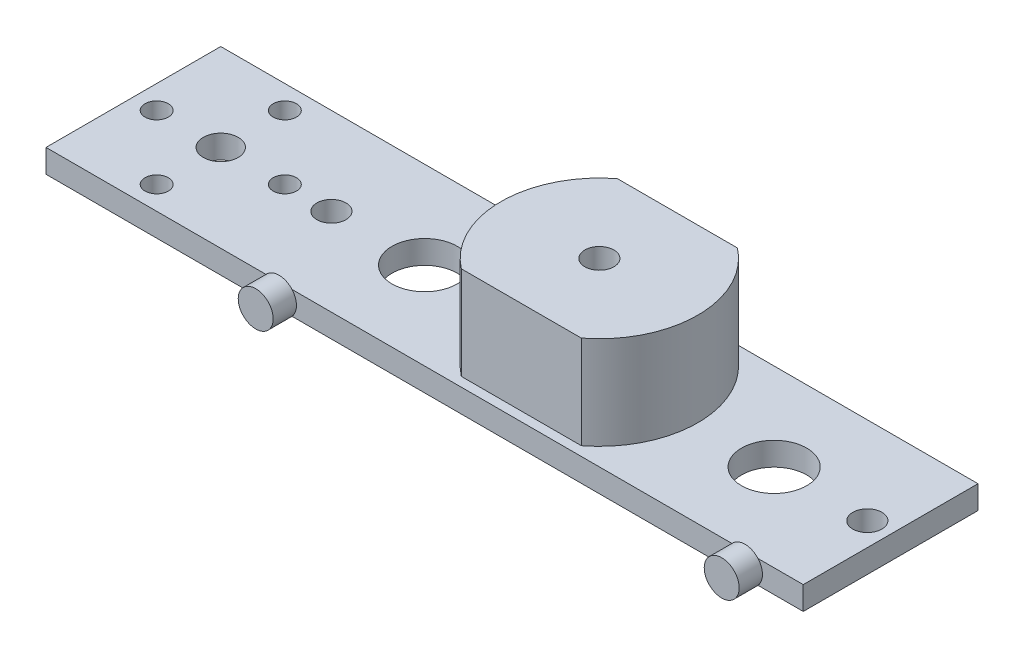
ISO-10303-21;
HEADER;
FILE_DESCRIPTION(('STEP AP214'),'2;1');
FILE_NAME('part.step','',(''),(''),'','','');
FILE_SCHEMA(('AUTOMOTIVE_DESIGN { 1 0 10303 214 1 1 1 1 }'));
ENDSEC;
DATA;
#1=APPLICATION_CONTEXT('core data for automotive mechanical design processes');
#2=APPLICATION_PROTOCOL_DEFINITION('international standard','automotive_design',2000,#1);
#3=PRODUCT_CONTEXT('',#1,'mechanical');
#4=PRODUCT('Part','Part','',(#3));
#5=PRODUCT_RELATED_PRODUCT_CATEGORY('part','',(#4));
#6=PRODUCT_DEFINITION_FORMATION('','',#4);
#7=PRODUCT_DEFINITION_CONTEXT('part definition',#1,'design');
#8=PRODUCT_DEFINITION('design','',#6,#7);
#9=PRODUCT_DEFINITION_SHAPE('','',#8);
#10=(LENGTH_UNIT() NAMED_UNIT(*) SI_UNIT(.MILLI.,.METRE.));
#11=(NAMED_UNIT(*) PLANE_ANGLE_UNIT() SI_UNIT($,.RADIAN.));
#12=(NAMED_UNIT(*) SI_UNIT($,.STERADIAN.) SOLID_ANGLE_UNIT());
#13=UNCERTAINTY_MEASURE_WITH_UNIT(LENGTH_MEASURE(1.E-05),#10,'distance_accuracy_value','');
#14=(GEOMETRIC_REPRESENTATION_CONTEXT(3) GLOBAL_UNCERTAINTY_ASSIGNED_CONTEXT((#13)) GLOBAL_UNIT_ASSIGNED_CONTEXT((#10,
#11,#12)) REPRESENTATION_CONTEXT('',''));
#15=CARTESIAN_POINT('',(0.,0.,0.));
#16=DIRECTION('',(0.,0.,1.));
#17=DIRECTION('',(1.,0.,0.));
#18=AXIS2_PLACEMENT_3D('',#15,#16,#17);
#19=CARTESIAN_POINT('',(0.,0.,0.));
#20=DIRECTION('',(0.,1.,0.));
#21=DIRECTION('',(0.,0.,1.));
#22=AXIS2_PLACEMENT_3D('',#19,#20,#21);
#23=PLANE('',#22);
#24=CARTESIAN_POINT('',(-23.,0.,0.));
#25=DIRECTION('',(0.,-1.,0.));
#26=DIRECTION('',(0.,0.,-1.));
#27=AXIS2_PLACEMENT_3D('',#24,#25,#26);
#28=CIRCLE('',#27,1.25);
#29=CARTESIAN_POINT('',(-23.,0.,-1.25));
#30=VERTEX_POINT('',#29);
#31=EDGE_CURVE('E362',#30,#30,#28,.T.);
#32=ORIENTED_EDGE('',*,*,#31,.F.);
#33=EDGE_LOOP('',(#32));
#34=FACE_BOUND('',#33,.T.);
#35=CARTESIAN_POINT('',(23.,0.,0.));
#36=DIRECTION('',(0.,1.,0.));
#37=DIRECTION('',(0.,0.,1.));
#38=AXIS2_PLACEMENT_3D('',#35,#36,#37);
#39=CIRCLE('',#38,1.25);
#40=CARTESIAN_POINT('',(23.,0.,1.25));
#41=VERTEX_POINT('',#40);
#42=EDGE_CURVE('E363',#41,#41,#39,.T.);
#43=ORIENTED_EDGE('',*,*,#42,.T.);
#44=EDGE_LOOP('',(#43));
#45=FACE_BOUND('',#44,.T.);
#46=DIRECTION('',(0.,0.,-1.));
#47=VECTOR('',#46,1.);
#48=CARTESIAN_POINT('',(-40.,0.,0.));
#49=LINE('',#48,#47);
#50=CARTESIAN_POINT('',(-40.,0.,7.5));
#51=VERTEX_POINT('',#50);
#52=CARTESIAN_POINT('',(-40.,0.,-7.5));
#53=VERTEX_POINT('',#52);
#54=EDGE_CURVE('E426',#51,#53,#49,.T.);
#55=ORIENTED_EDGE('',*,*,#54,.T.);
#56=DIRECTION('',(-1.,0.,0.));
#57=VECTOR('',#56,1.);
#58=CARTESIAN_POINT('',(0.,0.,-7.5));
#59=LINE('',#58,#57);
#60=CARTESIAN_POINT('',(25.,0.,-7.5));
#61=VERTEX_POINT('',#60);
#62=EDGE_CURVE('E417',#61,#53,#59,.T.);
#63=ORIENTED_EDGE('',*,*,#62,.F.);
#64=DIRECTION('',(0.,0.,1.));
#65=VECTOR('',#64,1.);
#66=CARTESIAN_POINT('',(25.,0.,-7.5));
#67=LINE('',#66,#65);
#68=CARTESIAN_POINT('',(25.,0.,7.5));
#69=VERTEX_POINT('',#68);
#70=EDGE_CURVE('E367',#61,#69,#67,.T.);
#71=ORIENTED_EDGE('',*,*,#70,.T.);
#72=DIRECTION('',(-1.,0.,0.));
#73=VECTOR('',#72,1.);
#74=CARTESIAN_POINT('',(0.,0.,7.5));
#75=LINE('',#74,#73);
#76=CARTESIAN_POINT('',(21.1180339887499,0.,7.5));
#77=VERTEX_POINT('',#76);
#78=EDGE_CURVE('E432',#69,#77,#75,.T.);
#79=ORIENTED_EDGE('',*,*,#78,.T.);
#80=CARTESIAN_POINT('',(18.8819660112501,0.,7.5));
#81=VERTEX_POINT('',#80);
#82=EDGE_CURVE('E436',#77,#81,#75,.T.);
#83=ORIENTED_EDGE('',*,*,#82,.T.);
#84=CARTESIAN_POINT('',(-18.8819660112501,0.,7.5));
#85=VERTEX_POINT('',#84);
#86=EDGE_CURVE('E873',#81,#85,#75,.T.);
#87=ORIENTED_EDGE('',*,*,#86,.T.);
#88=CARTESIAN_POINT('',(-21.1180339887499,0.,7.5));
#89=VERTEX_POINT('',#88);
#90=EDGE_CURVE('E904',#85,#89,#75,.T.);
#91=ORIENTED_EDGE('',*,*,#90,.T.);
#92=EDGE_CURVE('E430',#89,#51,#75,.T.);
#93=ORIENTED_EDGE('',*,*,#92,.T.);
#94=EDGE_LOOP('',(#55,#63,#71,#79,#83,#87,#91,#93));
#95=FACE_BOUND('',#94,.T.);
#96=CARTESIAN_POINT('',(15.,0.,0.));
#97=DIRECTION('',(0.,1.,0.));
#98=DIRECTION('',(0.,0.,1.));
#99=AXIS2_PLACEMENT_3D('',#96,#97,#98);
#100=CIRCLE('',#99,2.80000000000001);
#101=CARTESIAN_POINT('',(15.,0.,2.80000000000001));
#102=VERTEX_POINT('',#101);
#103=EDGE_CURVE('E345',#102,#102,#100,.T.);
#104=ORIENTED_EDGE('',*,*,#103,.T.);
#105=EDGE_LOOP('',(#104));
#106=FACE_BOUND('',#105,.T.);
#107=CARTESIAN_POINT('',(-15.,0.,0.));
#108=DIRECTION('',(0.,-1.,0.));
#109=DIRECTION('',(0.,0.,-1.));
#110=AXIS2_PLACEMENT_3D('',#107,#108,#109);
#111=CIRCLE('',#110,2.8);
#112=CARTESIAN_POINT('',(-15.,0.,-2.8));
#113=VERTEX_POINT('',#112);
#114=EDGE_CURVE('E344',#113,#113,#111,.T.);
#115=ORIENTED_EDGE('',*,*,#114,.F.);
#116=EDGE_LOOP('',(#115));
#117=FACE_BOUND('',#116,.T.);
#118=CARTESIAN_POINT('',(-27.,0.,0.));
#119=DIRECTION('',(0.,1.,0.));
#120=DIRECTION('',(0.,0.,1.));
#121=AXIS2_PLACEMENT_3D('',#118,#119,#120);
#122=CIRCLE('',#121,0.999999999999998);
#123=CARTESIAN_POINT('',(-27.,0.,0.999999999999999));
#124=VERTEX_POINT('',#123);
#125=EDGE_CURVE('E379',#124,#124,#122,.T.);
#126=ORIENTED_EDGE('',*,*,#125,.T.);
#127=EDGE_LOOP('',(#126));
#128=FACE_BOUND('',#127,.T.);
#129=CARTESIAN_POINT('',(-32.5,0.,5.5));
#130=DIRECTION('',(0.,1.,0.));
#131=DIRECTION('',(0.,0.,1.));
#132=AXIS2_PLACEMENT_3D('',#129,#130,#131);
#133=CIRCLE('',#132,0.999999999999998);
#134=CARTESIAN_POINT('',(-32.5,0.,6.5));
#135=VERTEX_POINT('',#134);
#136=EDGE_CURVE('E378',#135,#135,#133,.T.);
#137=ORIENTED_EDGE('',*,*,#136,.T.);
#138=EDGE_LOOP('',(#137));
#139=FACE_BOUND('',#138,.T.);
#140=CARTESIAN_POINT('',(-32.5,0.,0.));
#141=DIRECTION('',(0.,1.,0.));
#142=DIRECTION('',(0.,0.,1.));
#143=AXIS2_PLACEMENT_3D('',#140,#141,#142);
#144=CIRCLE('',#143,1.5);
#145=CARTESIAN_POINT('',(-32.5,0.,1.50000000000001));
#146=VERTEX_POINT('',#145);
#147=EDGE_CURVE('E396',#146,#146,#144,.T.);
#148=ORIENTED_EDGE('',*,*,#147,.T.);
#149=EDGE_LOOP('',(#148));
#150=FACE_BOUND('',#149,.T.);
#151=CARTESIAN_POINT('',(-38.,0.,0.));
#152=DIRECTION('',(0.,1.,0.));
#153=DIRECTION('',(0.,0.,1.));
#154=AXIS2_PLACEMENT_3D('',#151,#152,#153);
#155=CIRCLE('',#154,0.999999999999991);
#156=CARTESIAN_POINT('',(-38.,0.,0.999999999999992));
#157=VERTEX_POINT('',#156);
#158=EDGE_CURVE('E354',#157,#157,#155,.T.);
#159=ORIENTED_EDGE('',*,*,#158,.T.);
#160=EDGE_LOOP('',(#159));
#161=FACE_BOUND('',#160,.T.);
#162=CARTESIAN_POINT('',(-32.5,0.,-5.5));
#163=DIRECTION('',(0.,1.,0.));
#164=DIRECTION('',(0.,0.,1.));
#165=AXIS2_PLACEMENT_3D('',#162,#163,#164);
#166=CIRCLE('',#165,0.999999999999991);
#167=CARTESIAN_POINT('',(-32.5,0.,-4.50000000000001));
#168=VERTEX_POINT('',#167);
#169=EDGE_CURVE('E388',#168,#168,#166,.T.);
#170=ORIENTED_EDGE('',*,*,#169,.T.);
#171=EDGE_LOOP('',(#170));
#172=FACE_BOUND('',#171,.T.);
#173=DIRECTION('',(-1.,0.,0.));
#174=VECTOR('',#173,1.);
#175=CARTESIAN_POINT('',(0.,0.,6.));
#176=LINE('',#175,#174);
#177=CARTESIAN_POINT('',(4.90535421758714,0.,6.));
#178=VERTEX_POINT('',#177);
#179=CARTESIAN_POINT('',(-4.90535421758714,0.,6.));
#180=VERTEX_POINT('',#179);
#181=EDGE_CURVE('E13',#178,#180,#176,.T.);
#182=ORIENTED_EDGE('',*,*,#181,.F.);
#183=CARTESIAN_POINT('',(0.,0.,0.));
#184=DIRECTION('',(0.,1.,0.));
#185=DIRECTION('',(0.,0.,1.));
#186=AXIS2_PLACEMENT_3D('',#183,#184,#185);
#187=CIRCLE('',#186,7.75);
#188=CARTESIAN_POINT('',(4.90535421758714,0.,-6.));
#189=VERTEX_POINT('',#188);
#190=EDGE_CURVE('E460',#178,#189,#187,.T.);
#191=ORIENTED_EDGE('',*,*,#190,.T.);
#192=DIRECTION('',(-1.,0.,0.));
#193=VECTOR('',#192,1.);
#194=CARTESIAN_POINT('',(0.,0.,-6.));
#195=LINE('',#194,#193);
#196=CARTESIAN_POINT('',(-4.90535421758714,0.,-6.));
#197=VERTEX_POINT('',#196);
#198=EDGE_CURVE('E464',#189,#197,#195,.T.);
#199=ORIENTED_EDGE('',*,*,#198,.T.);
#200=CARTESIAN_POINT('',(0.,0.,0.));
#201=DIRECTION('',(0.,1.,0.));
#202=DIRECTION('',(0.,0.,1.));
#203=AXIS2_PLACEMENT_3D('',#200,#201,#202);
#204=CIRCLE('',#203,7.75);
#205=EDGE_CURVE('E130',#197,#180,#204,.T.);
#206=ORIENTED_EDGE('',*,*,#205,.T.);
#207=EDGE_LOOP('',(#182,#191,#199,#206));
#208=FACE_BOUND('',#207,.T.);
#209=ADVANCED_FACE('F121',(#34,#45,#95,#106,#117,#128,#139,#150,#161,#172,#208),#23,.F.);
#210=CARTESIAN_POINT('',(0.,2.,0.));
#211=DIRECTION('',(0.,1.,0.));
#212=DIRECTION('',(0.,0.,1.));
#213=AXIS2_PLACEMENT_3D('',#210,#211,#212);
#214=PLANE('',#213);
#215=CARTESIAN_POINT('',(-32.5,2.,-5.5));
#216=DIRECTION('',(0.,1.,0.));
#217=DIRECTION('',(0.,0.,1.));
#218=AXIS2_PLACEMENT_3D('',#215,#216,#217);
#219=CIRCLE('',#218,0.999999999999991);
#220=CARTESIAN_POINT('',(-32.5,2.,-4.50000000000001));
#221=VERTEX_POINT('',#220);
#222=EDGE_CURVE('E324',#221,#221,#219,.T.);
#223=ORIENTED_EDGE('',*,*,#222,.F.);
#224=EDGE_LOOP('',(#223));
#225=FACE_BOUND('',#224,.T.);
#226=CARTESIAN_POINT('',(-38.,2.,0.));
#227=DIRECTION('',(0.,1.,0.));
#228=DIRECTION('',(0.,0.,1.));
#229=AXIS2_PLACEMENT_3D('',#226,#227,#228);
#230=CIRCLE('',#229,0.999999999999991);
#231=CARTESIAN_POINT('',(-38.,2.,0.999999999999992));
#232=VERTEX_POINT('',#231);
#233=EDGE_CURVE('E392',#232,#232,#230,.T.);
#234=ORIENTED_EDGE('',*,*,#233,.F.);
#235=EDGE_LOOP('',(#234));
#236=FACE_BOUND('',#235,.T.);
#237=CARTESIAN_POINT('',(-32.5,2.,0.));
#238=DIRECTION('',(0.,1.,0.));
#239=DIRECTION('',(0.,0.,1.));
#240=AXIS2_PLACEMENT_3D('',#237,#238,#239);
#241=CIRCLE('',#240,1.5);
#242=CARTESIAN_POINT('',(-32.5,2.,1.50000000000001));
#243=VERTEX_POINT('',#242);
#244=EDGE_CURVE('E383',#243,#243,#241,.T.);
#245=ORIENTED_EDGE('',*,*,#244,.F.);
#246=EDGE_LOOP('',(#245));
#247=FACE_BOUND('',#246,.T.);
#248=CARTESIAN_POINT('',(-32.5,2.,5.5));
#249=DIRECTION('',(0.,1.,0.));
#250=DIRECTION('',(0.,0.,1.));
#251=AXIS2_PLACEMENT_3D('',#248,#249,#250);
#252=CIRCLE('',#251,0.999999999999998);
#253=CARTESIAN_POINT('',(-32.5,2.,6.5));
#254=VERTEX_POINT('',#253);
#255=EDGE_CURVE('E374',#254,#254,#252,.T.);
#256=ORIENTED_EDGE('',*,*,#255,.F.);
#257=EDGE_LOOP('',(#256));
#258=FACE_BOUND('',#257,.T.);
#259=CARTESIAN_POINT('',(-27.,2.,0.));
#260=DIRECTION('',(0.,1.,0.));
#261=DIRECTION('',(0.,0.,1.));
#262=AXIS2_PLACEMENT_3D('',#259,#260,#261);
#263=CIRCLE('',#262,0.999999999999998);
#264=CARTESIAN_POINT('',(-27.,2.,0.999999999999999));
#265=VERTEX_POINT('',#264);
#266=EDGE_CURVE('E384',#265,#265,#263,.T.);
#267=ORIENTED_EDGE('',*,*,#266,.F.);
#268=EDGE_LOOP('',(#267));
#269=FACE_BOUND('',#268,.T.);
#270=CARTESIAN_POINT('',(23.,2.,0.));
#271=DIRECTION('',(0.,1.,0.));
#272=DIRECTION('',(0.,0.,1.));
#273=AXIS2_PLACEMENT_3D('',#270,#271,#272);
#274=CIRCLE('',#273,1.25);
#275=CARTESIAN_POINT('',(23.,2.,1.25));
#276=VERTEX_POINT('',#275);
#277=EDGE_CURVE('E349',#276,#276,#274,.T.);
#278=ORIENTED_EDGE('',*,*,#277,.F.);
#279=EDGE_LOOP('',(#278));
#280=FACE_BOUND('',#279,.T.);
#281=CARTESIAN_POINT('',(15.,2.,0.));
#282=DIRECTION('',(0.,1.,0.));
#283=DIRECTION('',(0.,0.,1.));
#284=AXIS2_PLACEMENT_3D('',#281,#282,#283);
#285=CIRCLE('',#284,2.80000000000001);
#286=CARTESIAN_POINT('',(15.,2.,2.80000000000001));
#287=VERTEX_POINT('',#286);
#288=EDGE_CURVE('E350',#287,#287,#285,.T.);
#289=ORIENTED_EDGE('',*,*,#288,.F.);
#290=EDGE_LOOP('',(#289));
#291=FACE_BOUND('',#290,.T.);
#292=DIRECTION('',(0.,0.,-1.));
#293=VECTOR('',#292,1.);
#294=CARTESIAN_POINT('',(-40.,2.,0.));
#295=LINE('',#294,#293);
#296=CARTESIAN_POINT('',(-40.,2.,7.5));
#297=VERTEX_POINT('',#296);
#298=CARTESIAN_POINT('',(-40.,2.,-7.5));
#299=VERTEX_POINT('',#298);
#300=EDGE_CURVE('E412',#297,#299,#295,.T.);
#301=ORIENTED_EDGE('',*,*,#300,.F.);
#302=DIRECTION('',(-1.,0.,0.));
#303=VECTOR('',#302,1.);
#304=CARTESIAN_POINT('',(0.,2.,7.5));
#305=LINE('',#304,#303);
#306=CARTESIAN_POINT('',(-21.1180339887499,2.,7.5));
#307=VERTEX_POINT('',#306);
#308=EDGE_CURVE('E416',#307,#297,#305,.T.);
#309=ORIENTED_EDGE('',*,*,#308,.F.);
#310=CARTESIAN_POINT('',(-18.8819660112501,2.,7.5));
#311=VERTEX_POINT('',#310);
#312=EDGE_CURVE('E886',#311,#307,#305,.T.);
#313=ORIENTED_EDGE('',*,*,#312,.F.);
#314=CARTESIAN_POINT('',(18.8819660112501,2.,7.5));
#315=VERTEX_POINT('',#314);
#316=EDGE_CURVE('E870',#315,#311,#305,.T.);
#317=ORIENTED_EDGE('',*,*,#316,.F.);
#318=CARTESIAN_POINT('',(21.1180339887499,2.,7.5));
#319=VERTEX_POINT('',#318);
#320=EDGE_CURVE('E422',#319,#315,#305,.T.);
#321=ORIENTED_EDGE('',*,*,#320,.F.);
#322=CARTESIAN_POINT('',(25.,2.,7.5));
#323=VERTEX_POINT('',#322);
#324=EDGE_CURVE('E418',#323,#319,#305,.T.);
#325=ORIENTED_EDGE('',*,*,#324,.F.);
#326=DIRECTION('',(0.,0.,1.));
#327=VECTOR('',#326,1.);
#328=CARTESIAN_POINT('',(25.,2.,-7.5));
#329=LINE('',#328,#327);
#330=CARTESIAN_POINT('',(25.,2.,-7.5));
#331=VERTEX_POINT('',#330);
#332=EDGE_CURVE('E446',#331,#323,#329,.T.);
#333=ORIENTED_EDGE('',*,*,#332,.F.);
#334=DIRECTION('',(-1.,0.,0.));
#335=VECTOR('',#334,1.);
#336=CARTESIAN_POINT('',(0.,2.,-7.5));
#337=LINE('',#336,#335);
#338=EDGE_CURVE('E421',#331,#299,#337,.T.);
#339=ORIENTED_EDGE('',*,*,#338,.T.);
#340=EDGE_LOOP('',(#301,#309,#313,#317,#321,#325,#333,#339));
#341=FACE_BOUND('',#340,.T.);
#342=CARTESIAN_POINT('',(-15.,2.,0.));
#343=DIRECTION('',(0.,1.,0.));
#344=DIRECTION('',(0.,0.,1.));
#345=AXIS2_PLACEMENT_3D('',#342,#343,#344);
#346=CIRCLE('',#345,2.8);
#347=CARTESIAN_POINT('',(-15.,2.,2.8));
#348=VERTEX_POINT('',#347);
#349=EDGE_CURVE('E340',#348,#348,#346,.F.);
#350=ORIENTED_EDGE('',*,*,#349,.T.);
#351=EDGE_LOOP('',(#350));
#352=FACE_BOUND('',#351,.T.);
#353=CARTESIAN_POINT('',(-23.,2.,0.));
#354=DIRECTION('',(0.,1.,0.));
#355=DIRECTION('',(0.,0.,1.));
#356=AXIS2_PLACEMENT_3D('',#353,#354,#355);
#357=CIRCLE('',#356,1.25);
#358=CARTESIAN_POINT('',(-23.,2.,1.25000000000001));
#359=VERTEX_POINT('',#358);
#360=EDGE_CURVE('E358',#359,#359,#357,.F.);
#361=ORIENTED_EDGE('',*,*,#360,.T.);
#362=EDGE_LOOP('',(#361));
#363=FACE_BOUND('',#362,.T.);
#364=DIRECTION('',(-1.,0.,0.));
#365=VECTOR('',#364,1.);
#366=CARTESIAN_POINT('',(5.14902903468217,2.,-6.7));
#367=LINE('',#366,#365);
#368=CARTESIAN_POINT('',(5.14902903468217,2.,-6.7));
#369=VERTEX_POINT('',#368);
#370=CARTESIAN_POINT('',(-5.14902903468217,2.,-6.7));
#371=VERTEX_POINT('',#370);
#372=EDGE_CURVE('E299',#369,#371,#367,.T.);
#373=ORIENTED_EDGE('',*,*,#372,.F.);
#374=CARTESIAN_POINT('',(0.,2.,0.));
#375=DIRECTION('',(0.,1.,0.));
#376=DIRECTION('',(0.,0.,1.));
#377=AXIS2_PLACEMENT_3D('',#374,#375,#376);
#378=CIRCLE('',#377,8.45);
#379=CARTESIAN_POINT('',(5.14902903468217,2.,6.7));
#380=VERTEX_POINT('',#379);
#381=EDGE_CURVE('E280',#380,#369,#378,.T.);
#382=ORIENTED_EDGE('',*,*,#381,.F.);
#383=DIRECTION('',(1.,0.,0.));
#384=VECTOR('',#383,1.);
#385=CARTESIAN_POINT('',(5.14902903468217,2.,6.7));
#386=LINE('',#385,#384);
#387=CARTESIAN_POINT('',(-5.14902903468217,2.,6.7));
#388=VERTEX_POINT('',#387);
#389=EDGE_CURVE('E286',#388,#380,#386,.T.);
#390=ORIENTED_EDGE('',*,*,#389,.F.);
#391=CARTESIAN_POINT('',(0.,2.,0.));
#392=DIRECTION('',(0.,1.,0.));
#393=DIRECTION('',(0.,0.,1.));
#394=AXIS2_PLACEMENT_3D('',#391,#392,#393);
#395=CIRCLE('',#394,8.45);
#396=EDGE_CURVE('E302',#371,#388,#395,.T.);
#397=ORIENTED_EDGE('',*,*,#396,.F.);
#398=EDGE_LOOP('',(#373,#382,#390,#397));
#399=FACE_BOUND('',#398,.T.);
#400=ADVANCED_FACE('F488',(#225,#236,#247,#258,#269,#280,#291,#341,#352,#363,#399),#214,.T.);
#401=CARTESIAN_POINT('',(0.,2.,7.5));
#402=DIRECTION('',(0.,0.,1.));
#403=DIRECTION('',(1.,0.,0.));
#404=AXIS2_PLACEMENT_3D('',#401,#402,#403);
#405=PLANE('',#404);
#406=CARTESIAN_POINT('',(20.,0.999999999999999,7.5));
#407=DIRECTION('',(0.,0.,1.));
#408=DIRECTION('',(1.,0.,0.));
#409=AXIS2_PLACEMENT_3D('',#406,#407,#408);
#410=CIRCLE('',#409,1.5);
#411=EDGE_CURVE('E465',#315,#81,#410,.T.);
#412=ORIENTED_EDGE('',*,*,#411,.F.);
#413=ORIENTED_EDGE('',*,*,#316,.T.);
#414=CARTESIAN_POINT('',(-20.,0.999999999999995,7.5));
#415=DIRECTION('',(0.,0.,1.));
#416=DIRECTION('',(1.,0.,0.));
#417=AXIS2_PLACEMENT_3D('',#414,#415,#416);
#418=CIRCLE('',#417,1.5);
#419=EDGE_CURVE('E336',#85,#311,#418,.T.);
#420=ORIENTED_EDGE('',*,*,#419,.F.);
#421=ORIENTED_EDGE('',*,*,#86,.F.);
#422=EDGE_LOOP('',(#412,#413,#420,#421));
#423=FACE_BOUND('',#422,.T.);
#424=ADVANCED_FACE('F495',(#423),#405,.T.);
#425=EDGE_CURVE('E893',#307,#89,#418,.T.);
#426=ORIENTED_EDGE('',*,*,#425,.F.);
#427=ORIENTED_EDGE('',*,*,#308,.T.);
#428=DIRECTION('',(0.,-1.,0.));
#429=VECTOR('',#428,1.);
#430=CARTESIAN_POINT('',(-40.,2.,7.5));
#431=LINE('',#430,#429);
#432=EDGE_CURVE('E442',#297,#51,#431,.T.);
#433=ORIENTED_EDGE('',*,*,#432,.T.);
#434=ORIENTED_EDGE('',*,*,#92,.F.);
#435=EDGE_LOOP('',(#426,#427,#433,#434));
#436=FACE_BOUND('',#435,.T.);
#437=ADVANCED_FACE('F506',(#436),#405,.T.);
#438=CARTESIAN_POINT('',(0.,2.,-7.5));
#439=DIRECTION('',(0.,0.,1.));
#440=DIRECTION('',(1.,0.,0.));
#441=AXIS2_PLACEMENT_3D('',#438,#439,#440);
#442=PLANE('',#441);
#443=ORIENTED_EDGE('',*,*,#62,.T.);
#444=DIRECTION('',(0.,-1.,0.));
#445=VECTOR('',#444,1.);
#446=CARTESIAN_POINT('',(-40.,2.,-7.5));
#447=LINE('',#446,#445);
#448=EDGE_CURVE('E425',#299,#53,#447,.T.);
#449=ORIENTED_EDGE('',*,*,#448,.F.);
#450=ORIENTED_EDGE('',*,*,#338,.F.);
#451=DIRECTION('',(0.,-1.,0.));
#452=VECTOR('',#451,1.);
#453=CARTESIAN_POINT('',(25.,2.,-7.5));
#454=LINE('',#453,#452);
#455=EDGE_CURVE('E450',#331,#61,#454,.T.);
#456=ORIENTED_EDGE('',*,*,#455,.T.);
#457=EDGE_LOOP('',(#443,#449,#450,#456));
#458=FACE_BOUND('',#457,.T.);
#459=ADVANCED_FACE('F502',(#458),#442,.F.);
#460=EDGE_CURVE('E330',#77,#319,#410,.T.);
#461=ORIENTED_EDGE('',*,*,#460,.F.);
#462=ORIENTED_EDGE('',*,*,#78,.F.);
#463=DIRECTION('',(0.,-1.,0.));
#464=VECTOR('',#463,1.);
#465=CARTESIAN_POINT('',(25.,2.,7.5));
#466=LINE('',#465,#464);
#467=EDGE_CURVE('E431',#323,#69,#466,.T.);
#468=ORIENTED_EDGE('',*,*,#467,.F.);
#469=ORIENTED_EDGE('',*,*,#324,.T.);
#470=EDGE_LOOP('',(#461,#462,#468,#469));
#471=FACE_BOUND('',#470,.T.);
#472=ADVANCED_FACE('F505',(#471),#405,.T.);
#473=CARTESIAN_POINT('',(-40.,2.,0.));
#474=DIRECTION('',(-1.,0.,0.));
#475=DIRECTION('',(0.,0.,1.));
#476=AXIS2_PLACEMENT_3D('',#473,#474,#475);
#477=PLANE('',#476);
#478=ORIENTED_EDGE('',*,*,#54,.F.);
#479=ORIENTED_EDGE('',*,*,#432,.F.);
#480=ORIENTED_EDGE('',*,*,#300,.T.);
#481=ORIENTED_EDGE('',*,*,#448,.T.);
#482=EDGE_LOOP('',(#478,#479,#480,#481));
#483=FACE_BOUND('',#482,.T.);
#484=ADVANCED_FACE('F509',(#483),#477,.T.);
#485=CARTESIAN_POINT('',(25.,2.,-7.5));
#486=DIRECTION('',(1.,0.,0.));
#487=DIRECTION('',(0.,0.,-1.));
#488=AXIS2_PLACEMENT_3D('',#485,#486,#487);
#489=PLANE('',#488);
#490=ORIENTED_EDGE('',*,*,#70,.F.);
#491=ORIENTED_EDGE('',*,*,#455,.F.);
#492=ORIENTED_EDGE('',*,*,#332,.T.);
#493=ORIENTED_EDGE('',*,*,#467,.T.);
#494=EDGE_LOOP('',(#490,#491,#492,#493));
#495=FACE_BOUND('',#494,.T.);
#496=ADVANCED_FACE('F123',(#495),#489,.T.);
#497=CARTESIAN_POINT('',(0.,9.91959594928935,0.));
#498=DIRECTION('',(0.,-1.,0.));
#499=DIRECTION('',(0.,0.,-1.));
#500=AXIS2_PLACEMENT_3D('',#497,#498,#499);
#501=CYLINDRICAL_SURFACE('',#500,1.25);
#502=CARTESIAN_POINT('',(0.,7.5,0.));
#503=DIRECTION('',(0.,1.,0.));
#504=DIRECTION('',(0.,0.,1.));
#505=AXIS2_PLACEMENT_3D('',#502,#503,#504);
#506=CIRCLE('',#505,1.25);
#507=CARTESIAN_POINT('',(0.,7.5,1.25));
#508=VERTEX_POINT('',#507);
#509=EDGE_CURVE('E257',#508,#508,#506,.F.);
#510=ORIENTED_EDGE('',*,*,#509,.T.);
#511=EDGE_LOOP('',(#510));
#512=FACE_BOUND('',#511,.T.);
#513=CARTESIAN_POINT('',(0.,10.,0.));
#514=DIRECTION('',(0.,1.,0.));
#515=DIRECTION('',(0.,0.,1.));
#516=AXIS2_PLACEMENT_3D('',#513,#514,#515);
#517=CIRCLE('',#516,1.25);
#518=CARTESIAN_POINT('',(0.,10.,1.25));
#519=VERTEX_POINT('',#518);
#520=EDGE_CURVE('E270',#519,#519,#517,.F.);
#521=ORIENTED_EDGE('',*,*,#520,.F.);
#522=EDGE_LOOP('',(#521));
#523=FACE_BOUND('',#522,.T.);
#524=ADVANCED_FACE('F513',(#512,#523),#501,.F.);
#525=CARTESIAN_POINT('',(15.,9.91959594928935,0.));
#526=DIRECTION('',(0.,-1.,0.));
#527=DIRECTION('',(0.,0.,-1.));
#528=AXIS2_PLACEMENT_3D('',#525,#526,#527);
#529=CYLINDRICAL_SURFACE('',#528,2.80000000000001);
#530=ORIENTED_EDGE('',*,*,#103,.F.);
#531=EDGE_LOOP('',(#530));
#532=FACE_BOUND('',#531,.T.);
#533=ORIENTED_EDGE('',*,*,#288,.T.);
#534=EDGE_LOOP('',(#533));
#535=FACE_BOUND('',#534,.T.);
#536=ADVANCED_FACE('F519',(#532,#535),#529,.F.);
#537=CARTESIAN_POINT('',(-15.,9.91959594928935,0.));
#538=DIRECTION('',(0.,-1.,0.));
#539=DIRECTION('',(0.,0.,-1.));
#540=AXIS2_PLACEMENT_3D('',#537,#538,#539);
#541=CYLINDRICAL_SURFACE('',#540,2.8);
#542=ORIENTED_EDGE('',*,*,#114,.T.);
#543=EDGE_LOOP('',(#542));
#544=FACE_BOUND('',#543,.T.);
#545=ORIENTED_EDGE('',*,*,#349,.F.);
#546=EDGE_LOOP('',(#545));
#547=FACE_BOUND('',#546,.T.);
#548=ADVANCED_FACE('F524',(#544,#547),#541,.F.);
#549=CARTESIAN_POINT('',(23.,9.91959594928935,0.));
#550=DIRECTION('',(0.,-1.,0.));
#551=DIRECTION('',(0.,0.,-1.));
#552=AXIS2_PLACEMENT_3D('',#549,#550,#551);
#553=CYLINDRICAL_SURFACE('',#552,1.25);
#554=ORIENTED_EDGE('',*,*,#42,.F.);
#555=EDGE_LOOP('',(#554));
#556=FACE_BOUND('',#555,.T.);
#557=ORIENTED_EDGE('',*,*,#277,.T.);
#558=EDGE_LOOP('',(#557));
#559=FACE_BOUND('',#558,.T.);
#560=ADVANCED_FACE('F552',(#556,#559),#553,.F.);
#561=CARTESIAN_POINT('',(-23.,9.91959594928935,0.));
#562=DIRECTION('',(0.,-1.,0.));
#563=DIRECTION('',(0.,0.,-1.));
#564=AXIS2_PLACEMENT_3D('',#561,#562,#563);
#565=CYLINDRICAL_SURFACE('',#564,1.25);
#566=ORIENTED_EDGE('',*,*,#31,.T.);
#567=EDGE_LOOP('',(#566));
#568=FACE_BOUND('',#567,.T.);
#569=ORIENTED_EDGE('',*,*,#360,.F.);
#570=EDGE_LOOP('',(#569));
#571=FACE_BOUND('',#570,.T.);
#572=ADVANCED_FACE('F547',(#568,#571),#565,.F.);
#573=CARTESIAN_POINT('',(-27.,9.91959594928935,0.));
#574=DIRECTION('',(0.,-1.,0.));
#575=DIRECTION('',(0.,0.,-1.));
#576=AXIS2_PLACEMENT_3D('',#573,#574,#575);
#577=CYLINDRICAL_SURFACE('',#576,0.999999999999998);
#578=ORIENTED_EDGE('',*,*,#125,.F.);
#579=EDGE_LOOP('',(#578));
#580=FACE_BOUND('',#579,.T.);
#581=ORIENTED_EDGE('',*,*,#266,.T.);
#582=EDGE_LOOP('',(#581));
#583=FACE_BOUND('',#582,.T.);
#584=ADVANCED_FACE('F544',(#580,#583),#577,.F.);
#585=CARTESIAN_POINT('',(-32.5,9.91959594928935,5.5));
#586=DIRECTION('',(0.,-1.,0.));
#587=DIRECTION('',(0.,0.,-1.));
#588=AXIS2_PLACEMENT_3D('',#585,#586,#587);
#589=CYLINDRICAL_SURFACE('',#588,0.999999999999998);
#590=ORIENTED_EDGE('',*,*,#136,.F.);
#591=EDGE_LOOP('',(#590));
#592=FACE_BOUND('',#591,.T.);
#593=ORIENTED_EDGE('',*,*,#255,.T.);
#594=EDGE_LOOP('',(#593));
#595=FACE_BOUND('',#594,.T.);
#596=ADVANCED_FACE('F539',(#592,#595),#589,.F.);
#597=CARTESIAN_POINT('',(-32.5,9.91959594928935,0.));
#598=DIRECTION('',(0.,-1.,0.));
#599=DIRECTION('',(0.,0.,-1.));
#600=AXIS2_PLACEMENT_3D('',#597,#598,#599);
#601=CYLINDRICAL_SURFACE('',#600,1.5);
#602=ORIENTED_EDGE('',*,*,#147,.F.);
#603=EDGE_LOOP('',(#602));
#604=FACE_BOUND('',#603,.T.);
#605=ORIENTED_EDGE('',*,*,#244,.T.);
#606=EDGE_LOOP('',(#605));
#607=FACE_BOUND('',#606,.T.);
#608=ADVANCED_FACE('F536',(#604,#607),#601,.F.);
#609=CARTESIAN_POINT('',(-38.,9.91959594928935,0.));
#610=DIRECTION('',(0.,-1.,0.));
#611=DIRECTION('',(0.,0.,-1.));
#612=AXIS2_PLACEMENT_3D('',#609,#610,#611);
#613=CYLINDRICAL_SURFACE('',#612,0.999999999999991);
#614=ORIENTED_EDGE('',*,*,#158,.F.);
#615=EDGE_LOOP('',(#614));
#616=FACE_BOUND('',#615,.T.);
#617=ORIENTED_EDGE('',*,*,#233,.T.);
#618=EDGE_LOOP('',(#617));
#619=FACE_BOUND('',#618,.T.);
#620=ADVANCED_FACE('F534',(#616,#619),#613,.F.);
#621=CARTESIAN_POINT('',(-32.5,9.91959594928935,-5.5));
#622=DIRECTION('',(0.,-1.,0.));
#623=DIRECTION('',(0.,0.,-1.));
#624=AXIS2_PLACEMENT_3D('',#621,#622,#623);
#625=CYLINDRICAL_SURFACE('',#624,0.999999999999991);
#626=ORIENTED_EDGE('',*,*,#169,.F.);
#627=EDGE_LOOP('',(#626));
#628=FACE_BOUND('',#627,.T.);
#629=ORIENTED_EDGE('',*,*,#222,.T.);
#630=EDGE_LOOP('',(#629));
#631=FACE_BOUND('',#630,.T.);
#632=ADVANCED_FACE('F530',(#628,#631),#625,.F.);
#633=CARTESIAN_POINT('',(-20.,0.999999999999995,7.5));
#634=DIRECTION('',(0.,0.,1.));
#635=DIRECTION('',(1.,0.,0.));
#636=AXIS2_PLACEMENT_3D('',#633,#634,#635);
#637=PLANE('',#636);
#638=EDGE_CURVE('E331',#311,#307,#418,.T.);
#639=ORIENTED_EDGE('',*,*,#638,.F.);
#640=ORIENTED_EDGE('',*,*,#312,.T.);
#641=EDGE_LOOP('',(#639,#640));
#642=FACE_BOUND('',#641,.T.);
#643=ADVANCED_FACE('F533',(#642),#637,.F.);
#644=CARTESIAN_POINT('',(-20.,0.999999999999995,9.5));
#645=DIRECTION('',(0.,0.,-1.));
#646=DIRECTION('',(-1.,0.,0.));
#647=AXIS2_PLACEMENT_3D('',#644,#645,#646);
#648=CYLINDRICAL_SURFACE('',#647,1.5);
#649=CARTESIAN_POINT('',(-20.,0.999999999999995,9.5));
#650=DIRECTION('',(0.,0.,1.));
#651=DIRECTION('',(1.,0.,0.));
#652=AXIS2_PLACEMENT_3D('',#649,#650,#651);
#653=CIRCLE('',#652,1.5);
#654=CARTESIAN_POINT('',(-18.5,0.999999999999995,9.5));
#655=VERTEX_POINT('',#654);
#656=EDGE_CURVE('E319',#655,#655,#653,.T.);
#657=ORIENTED_EDGE('',*,*,#656,.F.);
#658=EDGE_LOOP('',(#657));
#659=FACE_BOUND('',#658,.T.);
#660=ORIENTED_EDGE('',*,*,#638,.T.);
#661=ORIENTED_EDGE('',*,*,#425,.T.);
#662=EDGE_CURVE('E335',#89,#85,#418,.T.);
#663=ORIENTED_EDGE('',*,*,#662,.T.);
#664=ORIENTED_EDGE('',*,*,#419,.T.);
#665=EDGE_LOOP('',(#660,#661,#663,#664));
#666=FACE_BOUND('',#665,.T.);
#667=ADVANCED_FACE('F566',(#659,#666),#648,.T.);
#668=CARTESIAN_POINT('',(-20.,0.999999999999995,9.5));
#669=DIRECTION('',(0.,0.,1.));
#670=DIRECTION('',(1.,0.,0.));
#671=AXIS2_PLACEMENT_3D('',#668,#669,#670);
#672=PLANE('',#671);
#673=ORIENTED_EDGE('',*,*,#656,.T.);
#674=EDGE_LOOP('',(#673));
#675=FACE_BOUND('',#674,.T.);
#676=ADVANCED_FACE('F562',(#675),#672,.T.);
#677=ORIENTED_EDGE('',*,*,#90,.F.);
#678=ORIENTED_EDGE('',*,*,#662,.F.);
#679=EDGE_LOOP('',(#677,#678));
#680=FACE_BOUND('',#679,.T.);
#681=ADVANCED_FACE('F565',(#680),#637,.F.);
#682=CARTESIAN_POINT('',(20.,0.999999999999999,7.5));
#683=DIRECTION('',(0.,0.,1.));
#684=DIRECTION('',(1.,0.,0.));
#685=AXIS2_PLACEMENT_3D('',#682,#683,#684);
#686=PLANE('',#685);
#687=EDGE_CURVE('E325',#319,#315,#410,.T.);
#688=ORIENTED_EDGE('',*,*,#687,.F.);
#689=ORIENTED_EDGE('',*,*,#320,.T.);
#690=EDGE_LOOP('',(#688,#689));
#691=FACE_BOUND('',#690,.T.);
#692=ADVANCED_FACE('F570',(#691),#686,.F.);
#693=CARTESIAN_POINT('',(20.,0.999999999999999,9.5));
#694=DIRECTION('',(0.,0.,-1.));
#695=DIRECTION('',(-1.,0.,0.));
#696=AXIS2_PLACEMENT_3D('',#693,#694,#695);
#697=CYLINDRICAL_SURFACE('',#696,1.5);
#698=CARTESIAN_POINT('',(20.,0.999999999999999,9.5));
#699=DIRECTION('',(0.,0.,1.));
#700=DIRECTION('',(1.,0.,0.));
#701=AXIS2_PLACEMENT_3D('',#698,#699,#700);
#702=CIRCLE('',#701,1.5);
#703=CARTESIAN_POINT('',(21.5,0.999999999999999,9.5));
#704=VERTEX_POINT('',#703);
#705=EDGE_CURVE('E320',#704,#704,#702,.T.);
#706=ORIENTED_EDGE('',*,*,#705,.F.);
#707=EDGE_LOOP('',(#706));
#708=FACE_BOUND('',#707,.T.);
#709=ORIENTED_EDGE('',*,*,#687,.T.);
#710=ORIENTED_EDGE('',*,*,#411,.T.);
#711=EDGE_CURVE('E329',#81,#77,#410,.T.);
#712=ORIENTED_EDGE('',*,*,#711,.T.);
#713=ORIENTED_EDGE('',*,*,#460,.T.);
#714=EDGE_LOOP('',(#709,#710,#712,#713));
#715=FACE_BOUND('',#714,.T.);
#716=ADVANCED_FACE('F575',(#708,#715),#697,.T.);
#717=CARTESIAN_POINT('',(20.,0.999999999999999,9.5));
#718=DIRECTION('',(0.,0.,1.));
#719=DIRECTION('',(1.,0.,0.));
#720=AXIS2_PLACEMENT_3D('',#717,#718,#719);
#721=PLANE('',#720);
#722=ORIENTED_EDGE('',*,*,#705,.T.);
#723=EDGE_LOOP('',(#722));
#724=FACE_BOUND('',#723,.T.);
#725=ADVANCED_FACE('F578',(#724),#721,.T.);
#726=ORIENTED_EDGE('',*,*,#82,.F.);
#727=ORIENTED_EDGE('',*,*,#711,.F.);
#728=EDGE_LOOP('',(#726,#727));
#729=FACE_BOUND('',#728,.T.);
#730=ADVANCED_FACE('F580',(#729),#686,.F.);
#731=CARTESIAN_POINT('',(0.,10.,0.));
#732=DIRECTION('',(0.,1.,0.));
#733=DIRECTION('',(0.,0.,1.));
#734=AXIS2_PLACEMENT_3D('',#731,#732,#733);
#735=PLANE('',#734);
#736=CARTESIAN_POINT('',(0.,10.,0.));
#737=DIRECTION('',(0.,1.,0.));
#738=DIRECTION('',(0.,0.,1.));
#739=AXIS2_PLACEMENT_3D('',#736,#737,#738);
#740=CIRCLE('',#739,8.45);
#741=CARTESIAN_POINT('',(5.14902903468217,10.,6.7));
#742=VERTEX_POINT('',#741);
#743=CARTESIAN_POINT('',(5.14902903468217,10.,-6.7));
#744=VERTEX_POINT('',#743);
#745=EDGE_CURVE('E281',#742,#744,#740,.T.);
#746=ORIENTED_EDGE('',*,*,#745,.T.);
#747=DIRECTION('',(-1.,0.,0.));
#748=VECTOR('',#747,1.);
#749=CARTESIAN_POINT('',(5.14902903468217,10.,-6.7));
#750=LINE('',#749,#748);
#751=CARTESIAN_POINT('',(-5.14902903468217,10.,-6.7));
#752=VERTEX_POINT('',#751);
#753=EDGE_CURVE('E285',#744,#752,#750,.T.);
#754=ORIENTED_EDGE('',*,*,#753,.T.);
#755=CARTESIAN_POINT('',(0.,10.,0.));
#756=DIRECTION('',(0.,1.,0.));
#757=DIRECTION('',(0.,0.,1.));
#758=AXIS2_PLACEMENT_3D('',#755,#756,#757);
#759=CIRCLE('',#758,8.45);
#760=CARTESIAN_POINT('',(-5.14902903468217,10.,6.7));
#761=VERTEX_POINT('',#760);
#762=EDGE_CURVE('E289',#752,#761,#759,.T.);
#763=ORIENTED_EDGE('',*,*,#762,.T.);
#764=DIRECTION('',(1.,0.,0.));
#765=VECTOR('',#764,1.);
#766=CARTESIAN_POINT('',(5.14902903468217,10.,6.7));
#767=LINE('',#766,#765);
#768=EDGE_CURVE('E292',#761,#742,#767,.T.);
#769=ORIENTED_EDGE('',*,*,#768,.T.);
#770=EDGE_LOOP('',(#746,#754,#763,#769));
#771=FACE_BOUND('',#770,.T.);
#772=ORIENTED_EDGE('',*,*,#520,.T.);
#773=EDGE_LOOP('',(#772));
#774=FACE_BOUND('',#773,.T.);
#775=ADVANCED_FACE('F583',(#771,#774),#735,.T.);
#776=CARTESIAN_POINT('',(0.,10.,0.));
#777=DIRECTION('',(0.,-1.,0.));
#778=DIRECTION('',(0.,0.,-1.));
#779=AXIS2_PLACEMENT_3D('',#776,#777,#778);
#780=CYLINDRICAL_SURFACE('',#779,8.45);
#781=ORIENTED_EDGE('',*,*,#381,.T.);
#782=DIRECTION('',(0.,-1.,0.));
#783=VECTOR('',#782,1.);
#784=CARTESIAN_POINT('',(5.14902903468217,10.,-6.7));
#785=LINE('',#784,#783);
#786=EDGE_CURVE('E316',#744,#369,#785,.T.);
#787=ORIENTED_EDGE('',*,*,#786,.F.);
#788=ORIENTED_EDGE('',*,*,#745,.F.);
#789=DIRECTION('',(0.,-1.,0.));
#790=VECTOR('',#789,1.);
#791=CARTESIAN_POINT('',(5.14902903468217,10.,6.7));
#792=LINE('',#791,#790);
#793=EDGE_CURVE('E295',#742,#380,#792,.T.);
#794=ORIENTED_EDGE('',*,*,#793,.T.);
#795=EDGE_LOOP('',(#781,#787,#788,#794));
#796=FACE_BOUND('',#795,.T.);
#797=ADVANCED_FACE('F588',(#796),#780,.T.);
#798=CARTESIAN_POINT('',(5.14902903468217,10.,-6.7));
#799=DIRECTION('',(0.,0.,1.));
#800=DIRECTION('',(1.,0.,0.));
#801=AXIS2_PLACEMENT_3D('',#798,#799,#800);
#802=PLANE('',#801);
#803=ORIENTED_EDGE('',*,*,#372,.T.);
#804=DIRECTION('',(0.,-1.,0.));
#805=VECTOR('',#804,1.);
#806=CARTESIAN_POINT('',(-5.14902903468217,10.,-6.7));
#807=LINE('',#806,#805);
#808=EDGE_CURVE('E312',#752,#371,#807,.T.);
#809=ORIENTED_EDGE('',*,*,#808,.F.);
#810=ORIENTED_EDGE('',*,*,#753,.F.);
#811=ORIENTED_EDGE('',*,*,#786,.T.);
#812=EDGE_LOOP('',(#803,#809,#810,#811));
#813=FACE_BOUND('',#812,.T.);
#814=ADVANCED_FACE('F591',(#813),#802,.F.);
#815=CARTESIAN_POINT('',(0.,10.,0.));
#816=DIRECTION('',(0.,-1.,0.));
#817=DIRECTION('',(0.,0.,-1.));
#818=AXIS2_PLACEMENT_3D('',#815,#816,#817);
#819=CYLINDRICAL_SURFACE('',#818,8.45);
#820=ORIENTED_EDGE('',*,*,#396,.T.);
#821=DIRECTION('',(0.,-1.,0.));
#822=VECTOR('',#821,1.);
#823=CARTESIAN_POINT('',(-5.14902903468217,10.,6.7));
#824=LINE('',#823,#822);
#825=EDGE_CURVE('E145',#761,#388,#824,.T.);
#826=ORIENTED_EDGE('',*,*,#825,.F.);
#827=ORIENTED_EDGE('',*,*,#762,.F.);
#828=ORIENTED_EDGE('',*,*,#808,.T.);
#829=EDGE_LOOP('',(#820,#826,#827,#828));
#830=FACE_BOUND('',#829,.T.);
#831=ADVANCED_FACE('F483',(#830),#819,.T.);
#832=CARTESIAN_POINT('',(5.14902903468217,10.,6.7));
#833=DIRECTION('',(0.,0.,-1.));
#834=DIRECTION('',(-1.,0.,0.));
#835=AXIS2_PLACEMENT_3D('',#832,#833,#834);
#836=PLANE('',#835);
#837=ORIENTED_EDGE('',*,*,#389,.T.);
#838=ORIENTED_EDGE('',*,*,#793,.F.);
#839=ORIENTED_EDGE('',*,*,#768,.F.);
#840=ORIENTED_EDGE('',*,*,#825,.T.);
#841=EDGE_LOOP('',(#837,#838,#839,#840));
#842=FACE_BOUND('',#841,.T.);
#843=ADVANCED_FACE('F475',(#842),#836,.F.);
#844=CARTESIAN_POINT('',(0.,-0.500000000000006,6.));
#845=DIRECTION('',(0.,0.,-1.));
#846=DIRECTION('',(-1.,0.,0.));
#847=AXIS2_PLACEMENT_3D('',#844,#845,#846);
#848=PLANE('',#847);
#849=ORIENTED_EDGE('',*,*,#181,.T.);
#850=DIRECTION('',(0.,1.,0.));
#851=VECTOR('',#850,1.);
#852=CARTESIAN_POINT('',(-4.90535421758714,-0.500000000000006,6.));
#853=LINE('',#852,#851);
#854=CARTESIAN_POINT('',(-4.90535421758714,7.5,6.));
#855=VERTEX_POINT('',#854);
#856=EDGE_CURVE('E245',#180,#855,#853,.T.);
#857=ORIENTED_EDGE('',*,*,#856,.T.);
#858=DIRECTION('',(-1.,0.,0.));
#859=VECTOR('',#858,1.);
#860=CARTESIAN_POINT('',(0.,7.5,6.));
#861=LINE('',#860,#859);
#862=CARTESIAN_POINT('',(4.90535421758714,7.5,6.));
#863=VERTEX_POINT('',#862);
#864=EDGE_CURVE('E255',#863,#855,#861,.T.);
#865=ORIENTED_EDGE('',*,*,#864,.F.);
#866=DIRECTION('',(0.,1.,0.));
#867=VECTOR('',#866,1.);
#868=CARTESIAN_POINT('',(4.90535421758714,-0.500000000000006,6.));
#869=LINE('',#868,#867);
#870=EDGE_CURVE('E274',#178,#863,#869,.T.);
#871=ORIENTED_EDGE('',*,*,#870,.F.);
#872=EDGE_LOOP('',(#849,#857,#865,#871));
#873=FACE_BOUND('',#872,.T.);
#874=ADVANCED_FACE('F473',(#873),#848,.T.);
#875=CARTESIAN_POINT('',(0.,-0.500000000000006,0.));
#876=DIRECTION('',(0.,1.,0.));
#877=DIRECTION('',(0.,0.,1.));
#878=AXIS2_PLACEMENT_3D('',#875,#876,#877);
#879=CYLINDRICAL_SURFACE('',#878,7.75);
#880=DIRECTION('',(0.,1.,0.));
#881=VECTOR('',#880,1.);
#882=CARTESIAN_POINT('',(-4.90535421758714,-0.500000000000006,-6.));
#883=LINE('',#882,#881);
#884=CARTESIAN_POINT('',(-4.90535421758714,7.5,-6.));
#885=VERTEX_POINT('',#884);
#886=EDGE_CURVE('E235',#197,#885,#883,.T.);
#887=ORIENTED_EDGE('',*,*,#886,.T.);
#888=CARTESIAN_POINT('',(0.,7.5,0.));
#889=DIRECTION('',(0.,1.,0.));
#890=DIRECTION('',(0.,0.,1.));
#891=AXIS2_PLACEMENT_3D('',#888,#889,#890);
#892=CIRCLE('',#891,7.75);
#893=EDGE_CURVE('E239',#885,#855,#892,.T.);
#894=ORIENTED_EDGE('',*,*,#893,.T.);
#895=ORIENTED_EDGE('',*,*,#856,.F.);
#896=ORIENTED_EDGE('',*,*,#205,.F.);
#897=EDGE_LOOP('',(#887,#894,#895,#896));
#898=FACE_BOUND('',#897,.T.);
#899=ADVANCED_FACE('F237',(#898),#879,.F.);
#900=CARTESIAN_POINT('',(0.,-0.500000000000006,-6.));
#901=DIRECTION('',(0.,0.,-1.));
#902=DIRECTION('',(-1.,0.,0.));
#903=AXIS2_PLACEMENT_3D('',#900,#901,#902);
#904=PLANE('',#903);
#905=DIRECTION('',(0.,1.,0.));
#906=VECTOR('',#905,1.);
#907=CARTESIAN_POINT('',(4.90535421758714,-0.500000000000006,-6.));
#908=LINE('',#907,#906);
#909=CARTESIAN_POINT('',(4.90535421758714,7.5,-6.));
#910=VERTEX_POINT('',#909);
#911=EDGE_CURVE('E137',#189,#910,#908,.T.);
#912=ORIENTED_EDGE('',*,*,#911,.T.);
#913=DIRECTION('',(-1.,0.,0.));
#914=VECTOR('',#913,1.);
#915=CARTESIAN_POINT('',(0.,7.5,-6.));
#916=LINE('',#915,#914);
#917=EDGE_CURVE('E253',#910,#885,#916,.T.);
#918=ORIENTED_EDGE('',*,*,#917,.T.);
#919=ORIENTED_EDGE('',*,*,#886,.F.);
#920=ORIENTED_EDGE('',*,*,#198,.F.);
#921=EDGE_LOOP('',(#912,#918,#919,#920));
#922=FACE_BOUND('',#921,.T.);
#923=ADVANCED_FACE('F259',(#922),#904,.F.);
#924=CARTESIAN_POINT('',(0.,-0.500000000000006,0.));
#925=DIRECTION('',(0.,1.,0.));
#926=DIRECTION('',(0.,0.,1.));
#927=AXIS2_PLACEMENT_3D('',#924,#925,#926);
#928=CYLINDRICAL_SURFACE('',#927,7.75);
#929=ORIENTED_EDGE('',*,*,#870,.T.);
#930=CARTESIAN_POINT('',(0.,7.5,0.));
#931=DIRECTION('',(0.,1.,0.));
#932=DIRECTION('',(0.,0.,1.));
#933=AXIS2_PLACEMENT_3D('',#930,#931,#932);
#934=CIRCLE('',#933,7.75);
#935=EDGE_CURVE('E261',#863,#910,#934,.T.);
#936=ORIENTED_EDGE('',*,*,#935,.T.);
#937=ORIENTED_EDGE('',*,*,#911,.F.);
#938=ORIENTED_EDGE('',*,*,#190,.F.);
#939=EDGE_LOOP('',(#929,#936,#937,#938));
#940=FACE_BOUND('',#939,.T.);
#941=ADVANCED_FACE('F471',(#940),#928,.F.);
#942=CARTESIAN_POINT('',(0.,7.5,0.));
#943=DIRECTION('',(0.,1.,0.));
#944=DIRECTION('',(0.,0.,1.));
#945=AXIS2_PLACEMENT_3D('',#942,#943,#944);
#946=PLANE('',#945);
#947=ORIENTED_EDGE('',*,*,#864,.T.);
#948=ORIENTED_EDGE('',*,*,#893,.F.);
#949=ORIENTED_EDGE('',*,*,#917,.F.);
#950=ORIENTED_EDGE('',*,*,#935,.F.);
#951=EDGE_LOOP('',(#947,#948,#949,#950));
#952=FACE_BOUND('',#951,.T.);
#953=ORIENTED_EDGE('',*,*,#509,.F.);
#954=EDGE_LOOP('',(#953));
#955=FACE_BOUND('',#954,.T.);
#956=ADVANCED_FACE('F250',(#952,#955),#946,.F.);
#957=CLOSED_SHELL('',(#209,#400,#424,#437,#459,#472,#484,#496,#524,#536,#548,#560,#572,#584,
#596,#608,#620,#632,#643,#667,#676,#681,#692,#716,#725,#730,#775,#797,#814,#831,#843,#874,#899,
#923,#941,#956));
#958=MANIFOLD_SOLID_BREP('B2',#957);
#959=ADVANCED_BREP_SHAPE_REPRESENTATION('',(#18,#958),#14);
#960=SHAPE_DEFINITION_REPRESENTATION(#9,#959);
ENDSEC;
END-ISO-10303-21;
